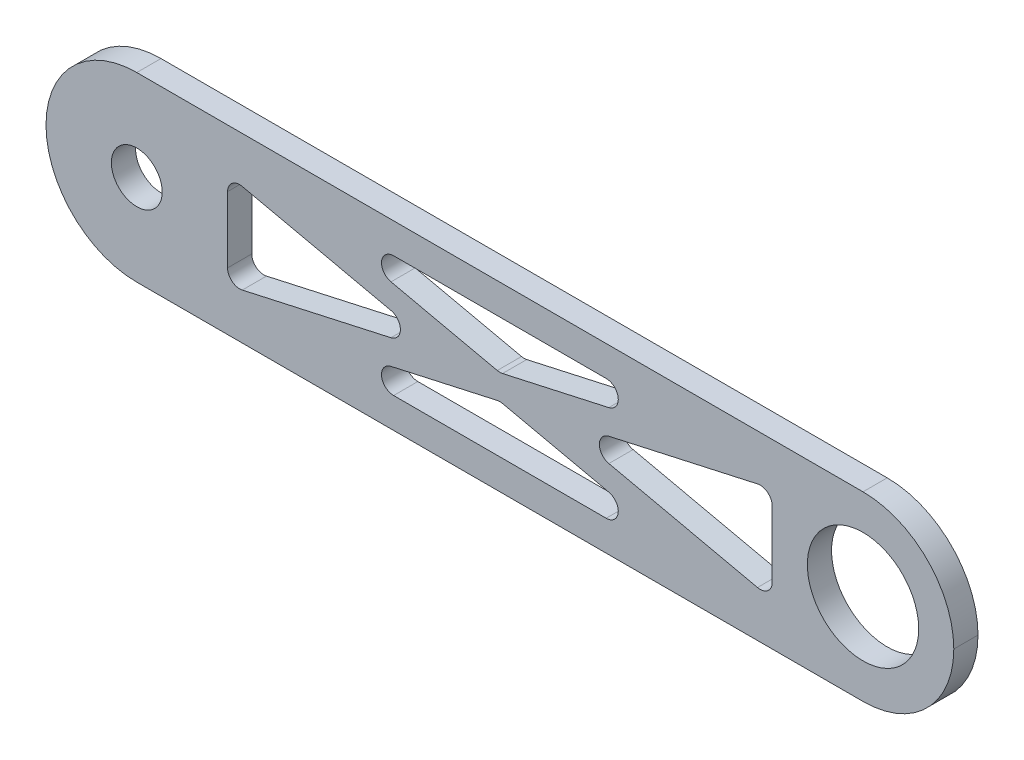
ISO-10303-21;
HEADER;
FILE_DESCRIPTION(('STEP AP214'),'2;1');
FILE_NAME('part.step','',(''),(''),'','','');
FILE_SCHEMA(('AUTOMOTIVE_DESIGN { 1 0 10303 214 1 1 1 1 }'));
ENDSEC;
DATA;
#1=APPLICATION_CONTEXT('core data for automotive mechanical design processes');
#2=APPLICATION_PROTOCOL_DEFINITION('international standard','automotive_design',2000,#1);
#3=PRODUCT_CONTEXT('',#1,'mechanical');
#4=PRODUCT('Part','Part','',(#3));
#5=PRODUCT_RELATED_PRODUCT_CATEGORY('part','',(#4));
#6=PRODUCT_DEFINITION_FORMATION('','',#4);
#7=PRODUCT_DEFINITION_CONTEXT('part definition',#1,'design');
#8=PRODUCT_DEFINITION('design','',#6,#7);
#9=PRODUCT_DEFINITION_SHAPE('','',#8);
#10=(LENGTH_UNIT() NAMED_UNIT(*) SI_UNIT(.MILLI.,.METRE.));
#11=(NAMED_UNIT(*) PLANE_ANGLE_UNIT() SI_UNIT($,.RADIAN.));
#12=(NAMED_UNIT(*) SI_UNIT($,.STERADIAN.) SOLID_ANGLE_UNIT());
#13=UNCERTAINTY_MEASURE_WITH_UNIT(LENGTH_MEASURE(1.E-05),#10,'distance_accuracy_value','');
#14=(GEOMETRIC_REPRESENTATION_CONTEXT(3) GLOBAL_UNCERTAINTY_ASSIGNED_CONTEXT((#13)) GLOBAL_UNIT_ASSIGNED_CONTEXT((#10,
#11,#12)) REPRESENTATION_CONTEXT('',''));
#15=CARTESIAN_POINT('',(0.,0.,0.));
#16=DIRECTION('',(0.,0.,1.));
#17=DIRECTION('',(1.,0.,0.));
#18=AXIS2_PLACEMENT_3D('',#15,#16,#17);
#19=CARTESIAN_POINT('',(-37.5,7.5,-2.));
#20=DIRECTION('',(0.,-1.,0.));
#21=DIRECTION('',(0.,0.,1.));
#22=AXIS2_PLACEMENT_3D('',#19,#20,#21);
#23=PLANE('',#22);
#24=DIRECTION('',(-1.,0.,0.));
#25=VECTOR('',#24,1.);
#26=CARTESIAN_POINT('',(-37.5,7.5,0.));
#27=LINE('',#26,#25);
#28=CARTESIAN_POINT('',(30.,7.5,0.));
#29=VERTEX_POINT('',#28);
#30=CARTESIAN_POINT('',(-30.,7.5,0.));
#31=VERTEX_POINT('',#30);
#32=EDGE_CURVE('E245',#29,#31,#27,.T.);
#33=ORIENTED_EDGE('',*,*,#32,.F.);
#34=DIRECTION('',(0.,0.,1.));
#35=VECTOR('',#34,1.);
#36=CARTESIAN_POINT('',(30.,7.5,-2.));
#37=LINE('',#36,#35);
#38=CARTESIAN_POINT('',(30.,7.5,-2.));
#39=VERTEX_POINT('',#38);
#40=EDGE_CURVE('E252',#39,#29,#37,.T.);
#41=ORIENTED_EDGE('',*,*,#40,.F.);
#42=DIRECTION('',(-1.,0.,0.));
#43=VECTOR('',#42,1.);
#44=CARTESIAN_POINT('',(-37.5,7.5,-2.));
#45=LINE('',#44,#43);
#46=CARTESIAN_POINT('',(-30.,7.5,-2.));
#47=VERTEX_POINT('',#46);
#48=EDGE_CURVE('E481',#39,#47,#45,.T.);
#49=ORIENTED_EDGE('',*,*,#48,.T.);
#50=DIRECTION('',(0.,0.,1.));
#51=VECTOR('',#50,1.);
#52=CARTESIAN_POINT('',(-30.,7.5,-2.));
#53=LINE('',#52,#51);
#54=EDGE_CURVE('E284',#31,#47,#53,.F.);
#55=ORIENTED_EDGE('',*,*,#54,.F.);
#56=EDGE_LOOP('',(#33,#41,#49,#55));
#57=FACE_BOUND('',#56,.T.);
#58=ADVANCED_FACE('F37',(#57),#23,.F.);
#59=CARTESIAN_POINT('',(-37.5,-7.5,-2.));
#60=DIRECTION('',(0.,1.,0.));
#61=DIRECTION('',(0.,0.,-1.));
#62=AXIS2_PLACEMENT_3D('',#59,#60,#61);
#63=PLANE('',#62);
#64=DIRECTION('',(1.,0.,0.));
#65=VECTOR('',#64,1.);
#66=CARTESIAN_POINT('',(-37.5,-7.5,0.));
#67=LINE('',#66,#65);
#68=CARTESIAN_POINT('',(-30.,-7.5,0.));
#69=VERTEX_POINT('',#68);
#70=CARTESIAN_POINT('',(30.,-7.5,0.));
#71=VERTEX_POINT('',#70);
#72=EDGE_CURVE('E261',#69,#71,#67,.T.);
#73=ORIENTED_EDGE('',*,*,#72,.F.);
#74=DIRECTION('',(0.,0.,1.));
#75=VECTOR('',#74,1.);
#76=CARTESIAN_POINT('',(-30.,-7.5,-2.));
#77=LINE('',#76,#75);
#78=CARTESIAN_POINT('',(-30.,-7.5,-2.));
#79=VERTEX_POINT('',#78);
#80=EDGE_CURVE('E270',#79,#69,#77,.T.);
#81=ORIENTED_EDGE('',*,*,#80,.F.);
#82=DIRECTION('',(1.,0.,0.));
#83=VECTOR('',#82,1.);
#84=CARTESIAN_POINT('',(-37.5,-7.5,-2.));
#85=LINE('',#84,#83);
#86=CARTESIAN_POINT('',(30.,-7.5,-2.));
#87=VERTEX_POINT('',#86);
#88=EDGE_CURVE('E256',#79,#87,#85,.T.);
#89=ORIENTED_EDGE('',*,*,#88,.T.);
#90=DIRECTION('',(0.,0.,1.));
#91=VECTOR('',#90,1.);
#92=CARTESIAN_POINT('',(30.,-7.5,-2.));
#93=LINE('',#92,#91);
#94=EDGE_CURVE('E273',#71,#87,#93,.F.);
#95=ORIENTED_EDGE('',*,*,#94,.F.);
#96=EDGE_LOOP('',(#73,#81,#89,#95));
#97=FACE_BOUND('',#96,.T.);
#98=ADVANCED_FACE('F498',(#97),#63,.F.);
#99=CARTESIAN_POINT('',(0.,0.,-2.));
#100=DIRECTION('',(0.,0.,1.));
#101=DIRECTION('',(-1.,0.,0.));
#102=AXIS2_PLACEMENT_3D('',#99,#100,#101);
#103=PLANE('',#102);
#104=DIRECTION('',(0.976187060183953,-0.216930457818656,0.));
#105=VECTOR('',#104,1.);
#106=CARTESIAN_POINT('',(4.60977222864645,0.,-2.));
#107=LINE('',#106,#105);
#108=CARTESIAN_POINT('',(9.00261399947423,-0.976187060183952,-2.));
#109=VERTEX_POINT('',#108);
#110=CARTESIAN_POINT('',(21.2830695421813,-3.70517718078553,-2.));
#111=VERTEX_POINT('',#110);
#112=EDGE_CURVE('E440',#109,#111,#107,.T.);
#113=ORIENTED_EDGE('',*,*,#112,.T.);
#114=CARTESIAN_POINT('',(21.5,-2.72899012060158,-2.));
#115=DIRECTION('',(0.,0.,-1.));
#116=DIRECTION('',(-1.,0.,0.));
#117=AXIS2_PLACEMENT_3D('',#114,#115,#116);
#118=CIRCLE('',#117,1.);
#119=CARTESIAN_POINT('',(22.5,-2.72899012060158,-2.));
#120=VERTEX_POINT('',#119);
#121=EDGE_CURVE('E45',#120,#111,#118,.T.);
#122=ORIENTED_EDGE('',*,*,#121,.F.);
#123=DIRECTION('',(0.,1.,0.));
#124=VECTOR('',#123,1.);
#125=CARTESIAN_POINT('',(22.5,-3.9756061714119,-2.));
#126=LINE('',#125,#124);
#127=CARTESIAN_POINT('',(22.5,2.72899012060158,-2.));
#128=VERTEX_POINT('',#127);
#129=EDGE_CURVE('E444',#120,#128,#126,.T.);
#130=ORIENTED_EDGE('',*,*,#129,.T.);
#131=CARTESIAN_POINT('',(21.5,2.72899012060158,-2.));
#132=DIRECTION('',(0.,0.,-1.));
#133=DIRECTION('',(-1.,0.,0.));
#134=AXIS2_PLACEMENT_3D('',#131,#132,#133);
#135=CIRCLE('',#134,1.);
#136=CARTESIAN_POINT('',(21.2830695421813,3.70517718078553,-2.));
#137=VERTEX_POINT('',#136);
#138=EDGE_CURVE('E425',#137,#128,#135,.T.);
#139=ORIENTED_EDGE('',*,*,#138,.F.);
#140=DIRECTION('',(-0.976187060183953,-0.216930457818656,0.));
#141=VECTOR('',#140,1.);
#142=CARTESIAN_POINT('',(4.60977222864645,0.,-2.));
#143=LINE('',#142,#141);
#144=CARTESIAN_POINT('',(9.00261399947423,0.976187060183954,-2.));
#145=VERTEX_POINT('',#144);
#146=EDGE_CURVE('E445',#137,#145,#143,.T.);
#147=ORIENTED_EDGE('',*,*,#146,.T.);
#148=CARTESIAN_POINT('',(9.21954445729289,0.,-2.));
#149=DIRECTION('',(0.,0.,-1.));
#150=DIRECTION('',(-1.,0.,0.));
#151=AXIS2_PLACEMENT_3D('',#148,#149,#150);
#152=CIRCLE('',#151,1.);
#153=EDGE_CURVE('E431',#109,#145,#152,.T.);
#154=ORIENTED_EDGE('',*,*,#153,.F.);
#155=EDGE_LOOP('',(#113,#122,#130,#139,#147,#154));
#156=FACE_BOUND('',#155,.T.);
#157=DIRECTION('',(-0.976187060183953,-0.216930457818656,0.));
#158=VECTOR('',#157,1.);
#159=CARTESIAN_POINT('',(-17.8902277713536,-5.,-2.));
#160=LINE('',#159,#158);
#161=CARTESIAN_POINT('',(-0.216930457818641,-1.07260059699224,-2.));
#162=VERTEX_POINT('',#161);
#163=CARTESIAN_POINT('',(-8.99738600052576,-3.02381293981605,-2.));
#164=VERTEX_POINT('',#163);
#165=EDGE_CURVE('E830',#162,#164,#160,.T.);
#166=ORIENTED_EDGE('',*,*,#165,.T.);
#167=CARTESIAN_POINT('',(-8.7804555427071,-4.,-2.));
#168=DIRECTION('',(0.,0.,-1.));
#169=DIRECTION('',(-1.,0.,0.));
#170=AXIS2_PLACEMENT_3D('',#167,#168,#169);
#171=CIRCLE('',#170,1.);
#172=CARTESIAN_POINT('',(-8.7804555427071,-5.,-2.));
#173=VERTEX_POINT('',#172);
#174=EDGE_CURVE('E413',#173,#164,#171,.T.);
#175=ORIENTED_EDGE('',*,*,#174,.F.);
#176=DIRECTION('',(1.,0.,0.));
#177=VECTOR('',#176,1.);
#178=CARTESIAN_POINT('',(-17.8902277713536,-5.,-2.));
#179=LINE('',#178,#177);
#180=CARTESIAN_POINT('',(8.78045554270711,-5.,-2.));
#181=VERTEX_POINT('',#180);
#182=EDGE_CURVE('E449',#173,#181,#179,.T.);
#183=ORIENTED_EDGE('',*,*,#182,.T.);
#184=CARTESIAN_POINT('',(8.78045554270711,-4.,-2.));
#185=DIRECTION('',(0.,0.,-1.));
#186=DIRECTION('',(-1.,0.,0.));
#187=AXIS2_PLACEMENT_3D('',#184,#185,#186);
#188=CIRCLE('',#187,1.);
#189=CARTESIAN_POINT('',(8.99738600052576,-3.02381293981605,-2.));
#190=VERTEX_POINT('',#189);
#191=EDGE_CURVE('E407',#190,#181,#188,.T.);
#192=ORIENTED_EDGE('',*,*,#191,.F.);
#193=DIRECTION('',(-0.976187060183953,0.216930457818656,0.));
#194=VECTOR('',#193,1.);
#195=CARTESIAN_POINT('',(0.,-1.0243938285881,-2.));
#196=LINE('',#195,#194);
#197=CARTESIAN_POINT('',(0.216930457818666,-1.07260059699225,-2.));
#198=VERTEX_POINT('',#197);
#199=EDGE_CURVE('E834',#190,#198,#196,.T.);
#200=ORIENTED_EDGE('',*,*,#199,.T.);
#201=CARTESIAN_POINT('',(0.,-2.0487876571762,-2.));
#202=DIRECTION('',(0.,0.,-1.));
#203=DIRECTION('',(-1.,0.,0.));
#204=AXIS2_PLACEMENT_3D('',#201,#202,#203);
#205=CIRCLE('',#204,1.);
#206=EDGE_CURVE('E419',#162,#198,#205,.T.);
#207=ORIENTED_EDGE('',*,*,#206,.F.);
#208=EDGE_LOOP('',(#166,#175,#183,#192,#200,#207));
#209=FACE_BOUND('',#208,.T.);
#210=DIRECTION('',(0.,-1.,0.));
#211=VECTOR('',#210,1.);
#212=CARTESIAN_POINT('',(-22.5,-3.9756061714119,-2.));
#213=LINE('',#212,#211);
#214=CARTESIAN_POINT('',(-22.5,2.72899012060158,-2.));
#215=VERTEX_POINT('',#214);
#216=CARTESIAN_POINT('',(-22.5,-2.72899012060158,-2.));
#217=VERTEX_POINT('',#216);
#218=EDGE_CURVE('E455',#215,#217,#213,.T.);
#219=ORIENTED_EDGE('',*,*,#218,.T.);
#220=CARTESIAN_POINT('',(-21.5,-2.72899012060158,-2.));
#221=DIRECTION('',(0.,0.,-1.));
#222=DIRECTION('',(-1.,0.,0.));
#223=AXIS2_PLACEMENT_3D('',#220,#221,#222);
#224=CIRCLE('',#223,1.);
#225=CARTESIAN_POINT('',(-21.2830695421813,-3.70517718078553,-2.));
#226=VERTEX_POINT('',#225);
#227=EDGE_CURVE('E395',#226,#217,#224,.T.);
#228=ORIENTED_EDGE('',*,*,#227,.F.);
#229=DIRECTION('',(0.976187060183953,0.216930457818656,0.));
#230=VECTOR('',#229,1.);
#231=CARTESIAN_POINT('',(-22.5,-3.9756061714119,-2.));
#232=LINE('',#231,#230);
#233=CARTESIAN_POINT('',(-9.00261399947423,-0.976187060183954,-2.));
#234=VERTEX_POINT('',#233);
#235=EDGE_CURVE('E458',#226,#234,#232,.T.);
#236=ORIENTED_EDGE('',*,*,#235,.T.);
#237=CARTESIAN_POINT('',(-9.21954445729288,0.,-2.));
#238=DIRECTION('',(0.,0.,-1.));
#239=DIRECTION('',(-1.,0.,0.));
#240=AXIS2_PLACEMENT_3D('',#237,#238,#239);
#241=CIRCLE('',#240,1.);
#242=CARTESIAN_POINT('',(-9.00261399947423,0.976187060183953,-2.));
#243=VERTEX_POINT('',#242);
#244=EDGE_CURVE('E389',#243,#234,#241,.T.);
#245=ORIENTED_EDGE('',*,*,#244,.F.);
#246=DIRECTION('',(-0.976187060183953,0.216930457818656,0.));
#247=VECTOR('',#246,1.);
#248=CARTESIAN_POINT('',(-22.5,3.9756061714119,-2.));
#249=LINE('',#248,#247);
#250=CARTESIAN_POINT('',(-21.2830695421813,3.70517718078553,-2.));
#251=VERTEX_POINT('',#250);
#252=EDGE_CURVE('E447',#243,#251,#249,.T.);
#253=ORIENTED_EDGE('',*,*,#252,.T.);
#254=CARTESIAN_POINT('',(-21.5,2.72899012060158,-2.));
#255=DIRECTION('',(0.,0.,-1.));
#256=DIRECTION('',(-1.,0.,0.));
#257=AXIS2_PLACEMENT_3D('',#254,#255,#256);
#258=CIRCLE('',#257,1.);
#259=EDGE_CURVE('E401',#215,#251,#258,.T.);
#260=ORIENTED_EDGE('',*,*,#259,.F.);
#261=EDGE_LOOP('',(#219,#228,#236,#245,#253,#260));
#262=FACE_BOUND('',#261,.T.);
#263=DIRECTION('',(0.976187060183953,0.216930457818656,0.));
#264=VECTOR('',#263,1.);
#265=CARTESIAN_POINT('',(0.,1.0243938285881,-2.));
#266=LINE('',#265,#264);
#267=CARTESIAN_POINT('',(0.21693045781866,1.07260059699225,-2.));
#268=VERTEX_POINT('',#267);
#269=CARTESIAN_POINT('',(8.99738600052576,3.02381293981605,-2.));
#270=VERTEX_POINT('',#269);
#271=EDGE_CURVE('E464',#268,#270,#266,.T.);
#272=ORIENTED_EDGE('',*,*,#271,.T.);
#273=CARTESIAN_POINT('',(8.7804555427071,4.,-2.));
#274=DIRECTION('',(0.,0.,-1.));
#275=DIRECTION('',(-1.,0.,0.));
#276=AXIS2_PLACEMENT_3D('',#273,#274,#275);
#277=CIRCLE('',#276,1.);
#278=CARTESIAN_POINT('',(8.7804555427071,5.,-2.));
#279=VERTEX_POINT('',#278);
#280=EDGE_CURVE('E377',#279,#270,#277,.T.);
#281=ORIENTED_EDGE('',*,*,#280,.F.);
#282=DIRECTION('',(-1.,0.,0.));
#283=VECTOR('',#282,1.);
#284=CARTESIAN_POINT('',(-17.8902277713536,5.,-2.));
#285=LINE('',#284,#283);
#286=CARTESIAN_POINT('',(-8.7804555427071,5.,-2.));
#287=VERTEX_POINT('',#286);
#288=EDGE_CURVE('E467',#279,#287,#285,.T.);
#289=ORIENTED_EDGE('',*,*,#288,.T.);
#290=CARTESIAN_POINT('',(-8.7804555427071,4.,-2.));
#291=DIRECTION('',(0.,0.,-1.));
#292=DIRECTION('',(-1.,0.,0.));
#293=AXIS2_PLACEMENT_3D('',#290,#291,#292);
#294=CIRCLE('',#293,1.);
#295=CARTESIAN_POINT('',(-8.99738600052576,3.02381293981605,-2.));
#296=VERTEX_POINT('',#295);
#297=EDGE_CURVE('E371',#296,#287,#294,.T.);
#298=ORIENTED_EDGE('',*,*,#297,.F.);
#299=DIRECTION('',(0.976187060183953,-0.216930457818656,0.));
#300=VECTOR('',#299,1.);
#301=CARTESIAN_POINT('',(-17.8902277713536,5.,-2.));
#302=LINE('',#301,#300);
#303=CARTESIAN_POINT('',(-0.216930457818648,1.07260059699224,-2.));
#304=VERTEX_POINT('',#303);
#305=EDGE_CURVE('E461',#296,#304,#302,.T.);
#306=ORIENTED_EDGE('',*,*,#305,.T.);
#307=CARTESIAN_POINT('',(0.,2.0487876571762,-2.));
#308=DIRECTION('',(0.,0.,-1.));
#309=DIRECTION('',(-1.,0.,0.));
#310=AXIS2_PLACEMENT_3D('',#307,#308,#309);
#311=CIRCLE('',#310,1.);
#312=EDGE_CURVE('E383',#268,#304,#311,.T.);
#313=ORIENTED_EDGE('',*,*,#312,.F.);
#314=EDGE_LOOP('',(#272,#281,#289,#298,#306,#313));
#315=FACE_BOUND('',#314,.T.);
#316=CARTESIAN_POINT('',(-30.,0.,-2.));
#317=DIRECTION('',(0.,0.,1.));
#318=DIRECTION('',(1.,0.,0.));
#319=AXIS2_PLACEMENT_3D('',#316,#317,#318);
#320=CIRCLE('',#319,2.1);
#321=CARTESIAN_POINT('',(-27.9,0.,-2.));
#322=VERTEX_POINT('',#321);
#323=EDGE_CURVE('E470',#322,#322,#320,.T.);
#324=ORIENTED_EDGE('',*,*,#323,.T.);
#325=EDGE_LOOP('',(#324));
#326=FACE_BOUND('',#325,.T.);
#327=CARTESIAN_POINT('',(30.,0.,-2.));
#328=DIRECTION('',(0.,0.,1.));
#329=DIRECTION('',(1.,0.,0.));
#330=AXIS2_PLACEMENT_3D('',#327,#328,#329);
#331=CIRCLE('',#330,4.6);
#332=CARTESIAN_POINT('',(34.6,0.,-2.));
#333=VERTEX_POINT('',#332);
#334=EDGE_CURVE('E474',#333,#333,#331,.T.);
#335=ORIENTED_EDGE('',*,*,#334,.T.);
#336=EDGE_LOOP('',(#335));
#337=FACE_BOUND('',#336,.T.);
#338=CARTESIAN_POINT('',(-30.,0.,-2.));
#339=DIRECTION('',(0.,0.,-1.));
#340=DIRECTION('',(-1.,0.,0.));
#341=AXIS2_PLACEMENT_3D('',#338,#339,#340);
#342=CIRCLE('',#341,7.5);
#343=CARTESIAN_POINT('',(-37.5,0.,-2.));
#344=VERTEX_POINT('',#343);
#345=EDGE_CURVE('E278',#47,#344,#342,.F.);
#346=ORIENTED_EDGE('',*,*,#345,.F.);
#347=ORIENTED_EDGE('',*,*,#48,.F.);
#348=CARTESIAN_POINT('',(30.,0.,-2.));
#349=DIRECTION('',(0.,0.,-1.));
#350=DIRECTION('',(-1.,0.,0.));
#351=AXIS2_PLACEMENT_3D('',#348,#349,#350);
#352=CIRCLE('',#351,7.5);
#353=CARTESIAN_POINT('',(37.5,0.,-2.));
#354=VERTEX_POINT('',#353);
#355=EDGE_CURVE('E275',#354,#39,#352,.F.);
#356=ORIENTED_EDGE('',*,*,#355,.F.);
#357=CARTESIAN_POINT('',(30.,0.,-2.));
#358=DIRECTION('',(0.,0.,-1.));
#359=DIRECTION('',(-1.,0.,0.));
#360=AXIS2_PLACEMENT_3D('',#357,#358,#359);
#361=CIRCLE('',#360,7.5);
#362=EDGE_CURVE('E242',#87,#354,#361,.F.);
#363=ORIENTED_EDGE('',*,*,#362,.F.);
#364=ORIENTED_EDGE('',*,*,#88,.F.);
#365=CARTESIAN_POINT('',(-30.,0.,-2.));
#366=DIRECTION('',(0.,0.,-1.));
#367=DIRECTION('',(-1.,0.,0.));
#368=AXIS2_PLACEMENT_3D('',#365,#366,#367);
#369=CIRCLE('',#368,7.5);
#370=EDGE_CURVE('E281',#344,#79,#369,.F.);
#371=ORIENTED_EDGE('',*,*,#370,.F.);
#372=EDGE_LOOP('',(#346,#347,#356,#363,#364,#371));
#373=FACE_BOUND('',#372,.T.);
#374=ADVANCED_FACE('F441',(#156,#209,#262,#315,#326,#337,#373),#103,.F.);
#375=CARTESIAN_POINT('',(0.,0.,0.));
#376=DIRECTION('',(0.,0.,1.));
#377=DIRECTION('',(-1.,0.,0.));
#378=AXIS2_PLACEMENT_3D('',#375,#376,#377);
#379=PLANE('',#378);
#380=DIRECTION('',(0.976187060183953,0.216930457818656,0.));
#381=VECTOR('',#380,1.);
#382=CARTESIAN_POINT('',(0.216930457818657,-0.976187060183954,0.));
#383=LINE('',#382,#381);
#384=CARTESIAN_POINT('',(9.00261399947424,0.976187060183954,0.));
#385=VERTEX_POINT('',#384);
#386=CARTESIAN_POINT('',(21.2830695421813,3.70517718078554,0.));
#387=VERTEX_POINT('',#386);
#388=EDGE_CURVE('E322',#385,#387,#383,.T.);
#389=ORIENTED_EDGE('',*,*,#388,.T.);
#390=CARTESIAN_POINT('',(21.5,2.72899012060158,0.));
#391=DIRECTION('',(0.,0.,-1.));
#392=DIRECTION('',(-1.,0.,0.));
#393=AXIS2_PLACEMENT_3D('',#390,#391,#392);
#394=CIRCLE('',#393,1.);
#395=CARTESIAN_POINT('',(22.5,2.72899012060158,0.));
#396=VERTEX_POINT('',#395);
#397=EDGE_CURVE('E428',#396,#387,#394,.F.);
#398=ORIENTED_EDGE('',*,*,#397,.F.);
#399=DIRECTION('',(0.,-1.,0.));
#400=VECTOR('',#399,1.);
#401=CARTESIAN_POINT('',(22.5,0.,0.));
#402=LINE('',#401,#400);
#403=CARTESIAN_POINT('',(22.5,-2.72899012060158,0.));
#404=VERTEX_POINT('',#403);
#405=EDGE_CURVE('E319',#396,#404,#402,.T.);
#406=ORIENTED_EDGE('',*,*,#405,.T.);
#407=CARTESIAN_POINT('',(21.5,-2.72899012060158,0.));
#408=DIRECTION('',(0.,0.,-1.));
#409=DIRECTION('',(-1.,0.,0.));
#410=AXIS2_PLACEMENT_3D('',#407,#408,#409);
#411=CIRCLE('',#410,1.);
#412=CARTESIAN_POINT('',(21.2830695421813,-3.70517718078553,0.));
#413=VERTEX_POINT('',#412);
#414=EDGE_CURVE('E11',#413,#404,#411,.F.);
#415=ORIENTED_EDGE('',*,*,#414,.F.);
#416=DIRECTION('',(-0.976187060183953,0.216930457818656,0.));
#417=VECTOR('',#416,1.);
#418=CARTESIAN_POINT('',(0.216930457818657,0.976187060183956,0.));
#419=LINE('',#418,#417);
#420=CARTESIAN_POINT('',(9.00261399947424,-0.976187060183952,0.));
#421=VERTEX_POINT('',#420);
#422=EDGE_CURVE('E316',#413,#421,#419,.T.);
#423=ORIENTED_EDGE('',*,*,#422,.T.);
#424=CARTESIAN_POINT('',(9.21954445729289,0.,0.));
#425=DIRECTION('',(0.,0.,-1.));
#426=DIRECTION('',(-1.,0.,0.));
#427=AXIS2_PLACEMENT_3D('',#424,#425,#426);
#428=CIRCLE('',#427,1.);
#429=EDGE_CURVE('E433',#385,#421,#428,.F.);
#430=ORIENTED_EDGE('',*,*,#429,.F.);
#431=EDGE_LOOP('',(#389,#398,#406,#415,#423,#430));
#432=FACE_BOUND('',#431,.T.);
#433=DIRECTION('',(0.976187060183953,-0.216930457818656,0.));
#434=VECTOR('',#433,1.);
#435=CARTESIAN_POINT('',(-0.216930457818656,-0.976187060183952,0.));
#436=LINE('',#435,#434);
#437=CARTESIAN_POINT('',(0.216930457818667,-1.07260059699225,0.));
#438=VERTEX_POINT('',#437);
#439=CARTESIAN_POINT('',(8.99738600052577,-3.02381293981605,0.));
#440=VERTEX_POINT('',#439);
#441=EDGE_CURVE('E313',#438,#440,#436,.T.);
#442=ORIENTED_EDGE('',*,*,#441,.T.);
#443=CARTESIAN_POINT('',(8.78045554270711,-4.,0.));
#444=DIRECTION('',(0.,0.,-1.));
#445=DIRECTION('',(-1.,0.,0.));
#446=AXIS2_PLACEMENT_3D('',#443,#444,#445);
#447=CIRCLE('',#446,1.);
#448=CARTESIAN_POINT('',(8.78045554270711,-5.,0.));
#449=VERTEX_POINT('',#448);
#450=EDGE_CURVE('E410',#449,#440,#447,.F.);
#451=ORIENTED_EDGE('',*,*,#450,.F.);
#452=DIRECTION('',(-1.,0.,0.));
#453=VECTOR('',#452,1.);
#454=CARTESIAN_POINT('',(0.,-5.,0.));
#455=LINE('',#454,#453);
#456=CARTESIAN_POINT('',(-8.7804555427071,-5.,0.));
#457=VERTEX_POINT('',#456);
#458=EDGE_CURVE('E310',#449,#457,#455,.T.);
#459=ORIENTED_EDGE('',*,*,#458,.T.);
#460=CARTESIAN_POINT('',(-8.7804555427071,-4.,0.));
#461=DIRECTION('',(0.,0.,-1.));
#462=DIRECTION('',(-1.,0.,0.));
#463=AXIS2_PLACEMENT_3D('',#460,#461,#462);
#464=CIRCLE('',#463,1.);
#465=CARTESIAN_POINT('',(-8.99738600052576,-3.02381293981605,0.));
#466=VERTEX_POINT('',#465);
#467=EDGE_CURVE('E416',#466,#457,#464,.F.);
#468=ORIENTED_EDGE('',*,*,#467,.F.);
#469=DIRECTION('',(0.976187060183953,0.216930457818656,0.));
#470=VECTOR('',#469,1.);
#471=CARTESIAN_POINT('',(0.216930457818657,-0.976187060183955,0.));
#472=LINE('',#471,#470);
#473=CARTESIAN_POINT('',(-0.216930457818646,-1.07260059699224,0.));
#474=VERTEX_POINT('',#473);
#475=EDGE_CURVE('E307',#466,#474,#472,.T.);
#476=ORIENTED_EDGE('',*,*,#475,.T.);
#477=CARTESIAN_POINT('',(0.,-2.0487876571762,0.));
#478=DIRECTION('',(0.,0.,-1.));
#479=DIRECTION('',(-1.,0.,0.));
#480=AXIS2_PLACEMENT_3D('',#477,#478,#479);
#481=CIRCLE('',#480,1.);
#482=EDGE_CURVE('E422',#438,#474,#481,.F.);
#483=ORIENTED_EDGE('',*,*,#482,.F.);
#484=EDGE_LOOP('',(#442,#451,#459,#468,#476,#483));
#485=FACE_BOUND('',#484,.T.);
#486=DIRECTION('',(0.976187060183953,-0.216930457818656,0.));
#487=VECTOR('',#486,1.);
#488=CARTESIAN_POINT('',(-0.216930457818656,-0.976187060183954,0.));
#489=LINE('',#488,#487);
#490=CARTESIAN_POINT('',(-21.2830695421813,3.70517718078553,0.));
#491=VERTEX_POINT('',#490);
#492=CARTESIAN_POINT('',(-9.00261399947423,0.976187060183952,0.));
#493=VERTEX_POINT('',#492);
#494=EDGE_CURVE('E304',#491,#493,#489,.T.);
#495=ORIENTED_EDGE('',*,*,#494,.T.);
#496=CARTESIAN_POINT('',(-9.21954445729288,0.,0.));
#497=DIRECTION('',(0.,0.,-1.));
#498=DIRECTION('',(-1.,0.,0.));
#499=AXIS2_PLACEMENT_3D('',#496,#497,#498);
#500=CIRCLE('',#499,1.);
#501=CARTESIAN_POINT('',(-9.00261399947423,-0.976187060183954,0.));
#502=VERTEX_POINT('',#501);
#503=EDGE_CURVE('E392',#502,#493,#500,.F.);
#504=ORIENTED_EDGE('',*,*,#503,.F.);
#505=DIRECTION('',(-0.976187060183953,-0.216930457818656,0.));
#506=VECTOR('',#505,1.);
#507=CARTESIAN_POINT('',(-0.216930457818656,0.976187060183952,0.));
#508=LINE('',#507,#506);
#509=CARTESIAN_POINT('',(-21.2830695421813,-3.70517718078553,0.));
#510=VERTEX_POINT('',#509);
#511=EDGE_CURVE('E301',#502,#510,#508,.T.);
#512=ORIENTED_EDGE('',*,*,#511,.T.);
#513=CARTESIAN_POINT('',(-21.5,-2.72899012060158,0.));
#514=DIRECTION('',(0.,0.,-1.));
#515=DIRECTION('',(-1.,0.,0.));
#516=AXIS2_PLACEMENT_3D('',#513,#514,#515);
#517=CIRCLE('',#516,1.);
#518=CARTESIAN_POINT('',(-22.5,-2.72899012060158,0.));
#519=VERTEX_POINT('',#518);
#520=EDGE_CURVE('E398',#519,#510,#517,.F.);
#521=ORIENTED_EDGE('',*,*,#520,.F.);
#522=DIRECTION('',(0.,1.,0.));
#523=VECTOR('',#522,1.);
#524=CARTESIAN_POINT('',(-22.5,0.,0.));
#525=LINE('',#524,#523);
#526=CARTESIAN_POINT('',(-22.5,2.72899012060158,0.));
#527=VERTEX_POINT('',#526);
#528=EDGE_CURVE('E298',#519,#527,#525,.T.);
#529=ORIENTED_EDGE('',*,*,#528,.T.);
#530=CARTESIAN_POINT('',(-21.5,2.72899012060158,0.));
#531=DIRECTION('',(0.,0.,-1.));
#532=DIRECTION('',(-1.,0.,0.));
#533=AXIS2_PLACEMENT_3D('',#530,#531,#532);
#534=CIRCLE('',#533,1.);
#535=EDGE_CURVE('E404',#491,#527,#534,.F.);
#536=ORIENTED_EDGE('',*,*,#535,.F.);
#537=EDGE_LOOP('',(#495,#504,#512,#521,#529,#536));
#538=FACE_BOUND('',#537,.T.);
#539=DIRECTION('',(-0.976187060183953,0.216930457818656,0.));
#540=VECTOR('',#539,1.);
#541=CARTESIAN_POINT('',(0.216930457818657,0.976187060183955,0.));
#542=LINE('',#541,#540);
#543=CARTESIAN_POINT('',(-0.216930457818652,1.07260059699225,0.));
#544=VERTEX_POINT('',#543);
#545=CARTESIAN_POINT('',(-8.99738600052576,3.02381293981605,0.));
#546=VERTEX_POINT('',#545);
#547=EDGE_CURVE('E295',#544,#546,#542,.T.);
#548=ORIENTED_EDGE('',*,*,#547,.T.);
#549=CARTESIAN_POINT('',(-8.7804555427071,4.,0.));
#550=DIRECTION('',(0.,0.,-1.));
#551=DIRECTION('',(-1.,0.,0.));
#552=AXIS2_PLACEMENT_3D('',#549,#550,#551);
#553=CIRCLE('',#552,1.);
#554=CARTESIAN_POINT('',(-8.7804555427071,5.,0.));
#555=VERTEX_POINT('',#554);
#556=EDGE_CURVE('E374',#555,#546,#553,.F.);
#557=ORIENTED_EDGE('',*,*,#556,.F.);
#558=DIRECTION('',(1.,0.,0.));
#559=VECTOR('',#558,1.);
#560=CARTESIAN_POINT('',(0.,5.,0.));
#561=LINE('',#560,#559);
#562=CARTESIAN_POINT('',(8.7804555427071,5.,0.));
#563=VERTEX_POINT('',#562);
#564=EDGE_CURVE('E292',#555,#563,#561,.T.);
#565=ORIENTED_EDGE('',*,*,#564,.T.);
#566=CARTESIAN_POINT('',(8.7804555427071,4.,0.));
#567=DIRECTION('',(0.,0.,-1.));
#568=DIRECTION('',(-1.,0.,0.));
#569=AXIS2_PLACEMENT_3D('',#566,#567,#568);
#570=CIRCLE('',#569,1.);
#571=CARTESIAN_POINT('',(8.99738600052576,3.02381293981605,0.));
#572=VERTEX_POINT('',#571);
#573=EDGE_CURVE('E380',#572,#563,#570,.F.);
#574=ORIENTED_EDGE('',*,*,#573,.F.);
#575=DIRECTION('',(-0.976187060183953,-0.216930457818656,0.));
#576=VECTOR('',#575,1.);
#577=CARTESIAN_POINT('',(-0.216930457818656,0.976187060183954,0.));
#578=LINE('',#577,#576);
#579=CARTESIAN_POINT('',(0.21693045781866,1.07260059699225,0.));
#580=VERTEX_POINT('',#579);
#581=EDGE_CURVE('E286',#572,#580,#578,.T.);
#582=ORIENTED_EDGE('',*,*,#581,.T.);
#583=CARTESIAN_POINT('',(0.,2.0487876571762,0.));
#584=DIRECTION('',(0.,0.,-1.));
#585=DIRECTION('',(-1.,0.,0.));
#586=AXIS2_PLACEMENT_3D('',#583,#584,#585);
#587=CIRCLE('',#586,1.);
#588=EDGE_CURVE('E386',#544,#580,#587,.F.);
#589=ORIENTED_EDGE('',*,*,#588,.F.);
#590=EDGE_LOOP('',(#548,#557,#565,#574,#582,#589));
#591=FACE_BOUND('',#590,.T.);
#592=CARTESIAN_POINT('',(-30.,0.,0.));
#593=DIRECTION('',(0.,0.,1.));
#594=DIRECTION('',(1.,0.,0.));
#595=AXIS2_PLACEMENT_3D('',#592,#593,#594);
#596=CIRCLE('',#595,2.1);
#597=CARTESIAN_POINT('',(-27.9,0.,0.));
#598=VERTEX_POINT('',#597);
#599=EDGE_CURVE('E471',#598,#598,#596,.T.);
#600=ORIENTED_EDGE('',*,*,#599,.F.);
#601=EDGE_LOOP('',(#600));
#602=FACE_BOUND('',#601,.T.);
#603=CARTESIAN_POINT('',(30.,0.,0.));
#604=DIRECTION('',(0.,0.,1.));
#605=DIRECTION('',(1.,0.,0.));
#606=AXIS2_PLACEMENT_3D('',#603,#604,#605);
#607=CIRCLE('',#606,4.6);
#608=CARTESIAN_POINT('',(34.6,0.,0.));
#609=VERTEX_POINT('',#608);
#610=EDGE_CURVE('E289',#609,#609,#607,.T.);
#611=ORIENTED_EDGE('',*,*,#610,.F.);
#612=EDGE_LOOP('',(#611));
#613=FACE_BOUND('',#612,.T.);
#614=ORIENTED_EDGE('',*,*,#72,.T.);
#615=CARTESIAN_POINT('',(30.,0.,0.));
#616=DIRECTION('',(0.,0.,-1.));
#617=DIRECTION('',(-1.,0.,0.));
#618=AXIS2_PLACEMENT_3D('',#615,#616,#617);
#619=CIRCLE('',#618,7.5);
#620=CARTESIAN_POINT('',(37.5,0.,0.));
#621=VERTEX_POINT('',#620);
#622=EDGE_CURVE('E240',#621,#71,#619,.T.);
#623=ORIENTED_EDGE('',*,*,#622,.F.);
#624=CARTESIAN_POINT('',(30.,0.,0.));
#625=DIRECTION('',(0.,0.,-1.));
#626=DIRECTION('',(-1.,0.,0.));
#627=AXIS2_PLACEMENT_3D('',#624,#625,#626);
#628=CIRCLE('',#627,7.5);
#629=EDGE_CURVE('E249',#29,#621,#628,.T.);
#630=ORIENTED_EDGE('',*,*,#629,.F.);
#631=ORIENTED_EDGE('',*,*,#32,.T.);
#632=CARTESIAN_POINT('',(-30.,0.,0.));
#633=DIRECTION('',(0.,0.,-1.));
#634=DIRECTION('',(-1.,0.,0.));
#635=AXIS2_PLACEMENT_3D('',#632,#633,#634);
#636=CIRCLE('',#635,7.5);
#637=CARTESIAN_POINT('',(-37.5,0.,0.));
#638=VERTEX_POINT('',#637);
#639=EDGE_CURVE('E262',#638,#31,#636,.T.);
#640=ORIENTED_EDGE('',*,*,#639,.F.);
#641=CARTESIAN_POINT('',(-30.,0.,0.));
#642=DIRECTION('',(0.,0.,-1.));
#643=DIRECTION('',(-1.,0.,0.));
#644=AXIS2_PLACEMENT_3D('',#641,#642,#643);
#645=CIRCLE('',#644,7.5);
#646=EDGE_CURVE('E264',#69,#638,#645,.T.);
#647=ORIENTED_EDGE('',*,*,#646,.F.);
#648=EDGE_LOOP('',(#614,#623,#630,#631,#640,#647));
#649=FACE_BOUND('',#648,.T.);
#650=ADVANCED_FACE('F259',(#432,#485,#538,#591,#602,#613,#649),#379,.T.);
#651=CARTESIAN_POINT('',(30.,0.,-2.));
#652=DIRECTION('',(0.,0.,1.));
#653=DIRECTION('',(-1.,0.,0.));
#654=AXIS2_PLACEMENT_3D('',#651,#652,#653);
#655=CYLINDRICAL_SURFACE('',#654,7.5);
#656=ORIENTED_EDGE('',*,*,#40,.T.);
#657=ORIENTED_EDGE('',*,*,#629,.T.);
#658=DIRECTION('',(0.,0.,1.));
#659=VECTOR('',#658,1.);
#660=CARTESIAN_POINT('',(37.5,0.,-2.));
#661=LINE('',#660,#659);
#662=EDGE_CURVE('E235',#621,#354,#661,.F.);
#663=ORIENTED_EDGE('',*,*,#662,.T.);
#664=ORIENTED_EDGE('',*,*,#355,.T.);
#665=EDGE_LOOP('',(#656,#657,#663,#664));
#666=FACE_BOUND('',#665,.T.);
#667=ADVANCED_FACE('F250',(#666),#655,.T.);
#668=CARTESIAN_POINT('',(30.,0.,-2.));
#669=DIRECTION('',(0.,0.,1.));
#670=DIRECTION('',(-1.,0.,0.));
#671=AXIS2_PLACEMENT_3D('',#668,#669,#670);
#672=CYLINDRICAL_SURFACE('',#671,7.5);
#673=ORIENTED_EDGE('',*,*,#362,.T.);
#674=ORIENTED_EDGE('',*,*,#662,.F.);
#675=ORIENTED_EDGE('',*,*,#622,.T.);
#676=ORIENTED_EDGE('',*,*,#94,.T.);
#677=EDGE_LOOP('',(#673,#674,#675,#676));
#678=FACE_BOUND('',#677,.T.);
#679=ADVANCED_FACE('F237',(#678),#672,.T.);
#680=CARTESIAN_POINT('',(-30.,0.,-2.));
#681=DIRECTION('',(0.,0.,1.));
#682=DIRECTION('',(-1.,0.,0.));
#683=AXIS2_PLACEMENT_3D('',#680,#681,#682);
#684=CYLINDRICAL_SURFACE('',#683,7.5);
#685=DIRECTION('',(0.,0.,1.));
#686=VECTOR('',#685,1.);
#687=CARTESIAN_POINT('',(-37.5,0.,-2.));
#688=LINE('',#687,#686);
#689=EDGE_CURVE('E246',#344,#638,#688,.T.);
#690=ORIENTED_EDGE('',*,*,#689,.T.);
#691=ORIENTED_EDGE('',*,*,#639,.T.);
#692=ORIENTED_EDGE('',*,*,#54,.T.);
#693=ORIENTED_EDGE('',*,*,#345,.T.);
#694=EDGE_LOOP('',(#690,#691,#692,#693));
#695=FACE_BOUND('',#694,.T.);
#696=ADVANCED_FACE('F491',(#695),#684,.T.);
#697=CARTESIAN_POINT('',(-30.,0.,-2.));
#698=DIRECTION('',(0.,0.,1.));
#699=DIRECTION('',(-1.,0.,0.));
#700=AXIS2_PLACEMENT_3D('',#697,#698,#699);
#701=CYLINDRICAL_SURFACE('',#700,7.5);
#702=ORIENTED_EDGE('',*,*,#370,.T.);
#703=ORIENTED_EDGE('',*,*,#80,.T.);
#704=ORIENTED_EDGE('',*,*,#646,.T.);
#705=ORIENTED_EDGE('',*,*,#689,.F.);
#706=EDGE_LOOP('',(#702,#703,#704,#705));
#707=FACE_BOUND('',#706,.T.);
#708=ADVANCED_FACE('F494',(#707),#701,.T.);
#709=CARTESIAN_POINT('',(30.,0.,0.));
#710=DIRECTION('',(0.,0.,-1.));
#711=DIRECTION('',(1.,0.,0.));
#712=AXIS2_PLACEMENT_3D('',#709,#710,#711);
#713=CYLINDRICAL_SURFACE('',#712,4.6);
#714=ORIENTED_EDGE('',*,*,#610,.T.);
#715=EDGE_LOOP('',(#714));
#716=FACE_BOUND('',#715,.T.);
#717=ORIENTED_EDGE('',*,*,#334,.F.);
#718=EDGE_LOOP('',(#717));
#719=FACE_BOUND('',#718,.T.);
#720=ADVANCED_FACE('F521',(#716,#719),#713,.F.);
#721=CARTESIAN_POINT('',(-30.,0.,0.));
#722=DIRECTION('',(0.,0.,-1.));
#723=DIRECTION('',(1.,0.,0.));
#724=AXIS2_PLACEMENT_3D('',#721,#722,#723);
#725=CYLINDRICAL_SURFACE('',#724,2.1);
#726=ORIENTED_EDGE('',*,*,#599,.T.);
#727=EDGE_LOOP('',(#726));
#728=FACE_BOUND('',#727,.T.);
#729=ORIENTED_EDGE('',*,*,#323,.F.);
#730=EDGE_LOOP('',(#729));
#731=FACE_BOUND('',#730,.T.);
#732=ADVANCED_FACE('F612',(#728,#731),#725,.F.);
#733=CARTESIAN_POINT('',(-17.8902277713536,5.,8.));
#734=DIRECTION('',(-0.216930457818656,-0.976187060183953,0.));
#735=DIRECTION('',(0.976187060183953,-0.216930457818656,0.));
#736=AXIS2_PLACEMENT_3D('',#733,#734,#735);
#737=PLANE('',#736);
#738=ORIENTED_EDGE('',*,*,#547,.F.);
#739=DIRECTION('',(0.,0.,-1.));
#740=VECTOR('',#739,1.);
#741=CARTESIAN_POINT('',(-0.216930457818652,1.07260059699225,0.));
#742=LINE('',#741,#740);
#743=EDGE_CURVE('E325',#304,#544,#742,.F.);
#744=ORIENTED_EDGE('',*,*,#743,.F.);
#745=ORIENTED_EDGE('',*,*,#305,.F.);
#746=DIRECTION('',(0.,0.,-1.));
#747=VECTOR('',#746,1.);
#748=CARTESIAN_POINT('',(-8.99738600052576,3.02381293981605,-2.));
#749=LINE('',#748,#747);
#750=EDGE_CURVE('E327',#546,#296,#749,.T.);
#751=ORIENTED_EDGE('',*,*,#750,.F.);
#752=EDGE_LOOP('',(#738,#744,#745,#751));
#753=FACE_BOUND('',#752,.T.);
#754=ADVANCED_FACE('F605',(#753),#737,.F.);
#755=CARTESIAN_POINT('',(-17.8902277713536,5.,8.));
#756=DIRECTION('',(0.,1.,0.));
#757=DIRECTION('',(-1.,0.,0.));
#758=AXIS2_PLACEMENT_3D('',#755,#756,#757);
#759=PLANE('',#758);
#760=ORIENTED_EDGE('',*,*,#288,.F.);
#761=DIRECTION('',(0.,0.,-1.));
#762=VECTOR('',#761,1.);
#763=CARTESIAN_POINT('',(8.7804555427071,5.,-2.));
#764=LINE('',#763,#762);
#765=EDGE_CURVE('E329',#563,#279,#764,.T.);
#766=ORIENTED_EDGE('',*,*,#765,.F.);
#767=ORIENTED_EDGE('',*,*,#564,.F.);
#768=DIRECTION('',(0.,0.,-1.));
#769=VECTOR('',#768,1.);
#770=CARTESIAN_POINT('',(-8.7804555427071,5.,0.));
#771=LINE('',#770,#769);
#772=EDGE_CURVE('E331',#287,#555,#771,.F.);
#773=ORIENTED_EDGE('',*,*,#772,.F.);
#774=EDGE_LOOP('',(#760,#766,#767,#773));
#775=FACE_BOUND('',#774,.T.);
#776=ADVANCED_FACE('F602',(#775),#759,.F.);
#777=CARTESIAN_POINT('',(0.,1.0243938285881,8.));
#778=DIRECTION('',(0.216930457818656,-0.976187060183953,0.));
#779=DIRECTION('',(0.976187060183953,0.216930457818656,0.));
#780=AXIS2_PLACEMENT_3D('',#777,#778,#779);
#781=PLANE('',#780);
#782=ORIENTED_EDGE('',*,*,#271,.F.);
#783=DIRECTION('',(0.,0.,-1.));
#784=VECTOR('',#783,1.);
#785=CARTESIAN_POINT('',(0.21693045781866,1.07260059699225,-2.));
#786=LINE('',#785,#784);
#787=EDGE_CURVE('E333',#580,#268,#786,.T.);
#788=ORIENTED_EDGE('',*,*,#787,.F.);
#789=ORIENTED_EDGE('',*,*,#581,.F.);
#790=DIRECTION('',(0.,0.,-1.));
#791=VECTOR('',#790,1.);
#792=CARTESIAN_POINT('',(8.99738600052576,3.02381293981605,0.));
#793=LINE('',#792,#791);
#794=EDGE_CURVE('E335',#270,#572,#793,.F.);
#795=ORIENTED_EDGE('',*,*,#794,.F.);
#796=EDGE_LOOP('',(#782,#788,#789,#795));
#797=FACE_BOUND('',#796,.T.);
#798=ADVANCED_FACE('F600',(#797),#781,.F.);
#799=CARTESIAN_POINT('',(-22.5,3.9756061714119,8.));
#800=DIRECTION('',(0.216930457818656,0.976187060183953,0.));
#801=DIRECTION('',(-0.976187060183953,0.216930457818656,0.));
#802=AXIS2_PLACEMENT_3D('',#799,#800,#801);
#803=PLANE('',#802);
#804=ORIENTED_EDGE('',*,*,#494,.F.);
#805=DIRECTION('',(0.,0.,-1.));
#806=VECTOR('',#805,1.);
#807=CARTESIAN_POINT('',(-21.2830695421813,3.70517718078553,0.));
#808=LINE('',#807,#806);
#809=EDGE_CURVE('E337',#251,#491,#808,.F.);
#810=ORIENTED_EDGE('',*,*,#809,.F.);
#811=ORIENTED_EDGE('',*,*,#252,.F.);
#812=DIRECTION('',(0.,0.,-1.));
#813=VECTOR('',#812,1.);
#814=CARTESIAN_POINT('',(-9.00261399947423,0.976187060183952,-2.));
#815=LINE('',#814,#813);
#816=EDGE_CURVE('E339',#493,#243,#815,.T.);
#817=ORIENTED_EDGE('',*,*,#816,.F.);
#818=EDGE_LOOP('',(#804,#810,#811,#817));
#819=FACE_BOUND('',#818,.T.);
#820=ADVANCED_FACE('F592',(#819),#803,.F.);
#821=CARTESIAN_POINT('',(-22.5,-3.9756061714119,8.));
#822=DIRECTION('',(0.216930457818656,-0.976187060183953,0.));
#823=DIRECTION('',(0.976187060183953,0.216930457818656,0.));
#824=AXIS2_PLACEMENT_3D('',#821,#822,#823);
#825=PLANE('',#824);
#826=ORIENTED_EDGE('',*,*,#235,.F.);
#827=DIRECTION('',(0.,0.,-1.));
#828=VECTOR('',#827,1.);
#829=CARTESIAN_POINT('',(-21.2830695421813,-3.70517718078553,-2.));
#830=LINE('',#829,#828);
#831=EDGE_CURVE('E341',#510,#226,#830,.T.);
#832=ORIENTED_EDGE('',*,*,#831,.F.);
#833=ORIENTED_EDGE('',*,*,#511,.F.);
#834=DIRECTION('',(0.,0.,-1.));
#835=VECTOR('',#834,1.);
#836=CARTESIAN_POINT('',(-9.00261399947423,-0.976187060183953,0.));
#837=LINE('',#836,#835);
#838=EDGE_CURVE('E343',#234,#502,#837,.F.);
#839=ORIENTED_EDGE('',*,*,#838,.F.);
#840=EDGE_LOOP('',(#826,#832,#833,#839));
#841=FACE_BOUND('',#840,.T.);
#842=ADVANCED_FACE('F588',(#841),#825,.F.);
#843=CARTESIAN_POINT('',(-22.5,-3.9756061714119,8.));
#844=DIRECTION('',(-1.,0.,0.));
#845=DIRECTION('',(0.,0.,-1.));
#846=AXIS2_PLACEMENT_3D('',#843,#844,#845);
#847=PLANE('',#846);
#848=ORIENTED_EDGE('',*,*,#218,.F.);
#849=DIRECTION('',(0.,0.,-1.));
#850=VECTOR('',#849,1.);
#851=CARTESIAN_POINT('',(-22.5,2.72899012060158,-2.));
#852=LINE('',#851,#850);
#853=EDGE_CURVE('E345',#527,#215,#852,.T.);
#854=ORIENTED_EDGE('',*,*,#853,.F.);
#855=ORIENTED_EDGE('',*,*,#528,.F.);
#856=DIRECTION('',(0.,0.,-1.));
#857=VECTOR('',#856,1.);
#858=CARTESIAN_POINT('',(-22.5,-2.72899012060158,0.));
#859=LINE('',#858,#857);
#860=EDGE_CURVE('E347',#217,#519,#859,.F.);
#861=ORIENTED_EDGE('',*,*,#860,.F.);
#862=EDGE_LOOP('',(#848,#854,#855,#861));
#863=FACE_BOUND('',#862,.T.);
#864=ADVANCED_FACE('F591',(#863),#847,.F.);
#865=CARTESIAN_POINT('',(0.,-1.0243938285881,8.));
#866=DIRECTION('',(0.216930457818656,0.976187060183953,0.));
#867=DIRECTION('',(-0.976187060183953,0.216930457818656,0.));
#868=AXIS2_PLACEMENT_3D('',#865,#866,#867);
#869=PLANE('',#868);
#870=ORIENTED_EDGE('',*,*,#441,.F.);
#871=DIRECTION('',(0.,0.,-1.));
#872=VECTOR('',#871,1.);
#873=CARTESIAN_POINT('',(0.216930457818666,-1.07260059699225,0.));
#874=LINE('',#873,#872);
#875=EDGE_CURVE('E349',#198,#438,#874,.F.);
#876=ORIENTED_EDGE('',*,*,#875,.F.);
#877=ORIENTED_EDGE('',*,*,#199,.F.);
#878=DIRECTION('',(0.,0.,-1.));
#879=VECTOR('',#878,1.);
#880=CARTESIAN_POINT('',(8.99738600052576,-3.02381293981605,-2.));
#881=LINE('',#880,#879);
#882=EDGE_CURVE('E351',#440,#190,#881,.T.);
#883=ORIENTED_EDGE('',*,*,#882,.F.);
#884=EDGE_LOOP('',(#870,#876,#877,#883));
#885=FACE_BOUND('',#884,.T.);
#886=ADVANCED_FACE('F596',(#885),#869,.F.);
#887=CARTESIAN_POINT('',(-17.8902277713536,-5.,8.));
#888=DIRECTION('',(0.,-1.,0.));
#889=DIRECTION('',(1.,0.,0.));
#890=AXIS2_PLACEMENT_3D('',#887,#888,#889);
#891=PLANE('',#890);
#892=ORIENTED_EDGE('',*,*,#182,.F.);
#893=DIRECTION('',(0.,0.,-1.));
#894=VECTOR('',#893,1.);
#895=CARTESIAN_POINT('',(-8.7804555427071,-5.,-2.));
#896=LINE('',#895,#894);
#897=EDGE_CURVE('E353',#457,#173,#896,.T.);
#898=ORIENTED_EDGE('',*,*,#897,.F.);
#899=ORIENTED_EDGE('',*,*,#458,.F.);
#900=DIRECTION('',(0.,0.,-1.));
#901=VECTOR('',#900,1.);
#902=CARTESIAN_POINT('',(8.78045554270711,-5.,0.));
#903=LINE('',#902,#901);
#904=EDGE_CURVE('E355',#181,#449,#903,.F.);
#905=ORIENTED_EDGE('',*,*,#904,.F.);
#906=EDGE_LOOP('',(#892,#898,#899,#905));
#907=FACE_BOUND('',#906,.T.);
#908=ADVANCED_FACE('F661',(#907),#891,.F.);
#909=CARTESIAN_POINT('',(-17.8902277713536,-5.,8.));
#910=DIRECTION('',(-0.216930457818656,0.976187060183953,0.));
#911=DIRECTION('',(-0.976187060183953,-0.216930457818656,0.));
#912=AXIS2_PLACEMENT_3D('',#909,#910,#911);
#913=PLANE('',#912);
#914=ORIENTED_EDGE('',*,*,#165,.F.);
#915=DIRECTION('',(0.,0.,-1.));
#916=VECTOR('',#915,1.);
#917=CARTESIAN_POINT('',(-0.216930457818646,-1.07260059699224,-2.));
#918=LINE('',#917,#916);
#919=EDGE_CURVE('E357',#474,#162,#918,.T.);
#920=ORIENTED_EDGE('',*,*,#919,.F.);
#921=ORIENTED_EDGE('',*,*,#475,.F.);
#922=DIRECTION('',(0.,0.,-1.));
#923=VECTOR('',#922,1.);
#924=CARTESIAN_POINT('',(-8.99738600052576,-3.02381293981605,0.));
#925=LINE('',#924,#923);
#926=EDGE_CURVE('E359',#164,#466,#925,.F.);
#927=ORIENTED_EDGE('',*,*,#926,.F.);
#928=EDGE_LOOP('',(#914,#920,#921,#927));
#929=FACE_BOUND('',#928,.T.);
#930=ADVANCED_FACE('F586',(#929),#913,.F.);
#931=CARTESIAN_POINT('',(4.60977222864645,0.,8.));
#932=DIRECTION('',(-0.216930457818656,0.976187060183953,0.));
#933=DIRECTION('',(-0.976187060183953,-0.216930457818656,0.));
#934=AXIS2_PLACEMENT_3D('',#931,#932,#933);
#935=PLANE('',#934);
#936=ORIENTED_EDGE('',*,*,#388,.F.);
#937=DIRECTION('',(0.,0.,-1.));
#938=VECTOR('',#937,1.);
#939=CARTESIAN_POINT('',(9.00261399947423,0.976187060183954,0.));
#940=LINE('',#939,#938);
#941=EDGE_CURVE('E361',#145,#385,#940,.F.);
#942=ORIENTED_EDGE('',*,*,#941,.F.);
#943=ORIENTED_EDGE('',*,*,#146,.F.);
#944=DIRECTION('',(0.,0.,-1.));
#945=VECTOR('',#944,1.);
#946=CARTESIAN_POINT('',(21.2830695421813,3.70517718078554,-2.));
#947=LINE('',#946,#945);
#948=EDGE_CURVE('E363',#387,#137,#947,.T.);
#949=ORIENTED_EDGE('',*,*,#948,.F.);
#950=EDGE_LOOP('',(#936,#942,#943,#949));
#951=FACE_BOUND('',#950,.T.);
#952=ADVANCED_FACE('F579',(#951),#935,.F.);
#953=CARTESIAN_POINT('',(22.5,-3.9756061714119,8.));
#954=DIRECTION('',(1.,0.,0.));
#955=DIRECTION('',(0.,0.,1.));
#956=AXIS2_PLACEMENT_3D('',#953,#954,#955);
#957=PLANE('',#956);
#958=ORIENTED_EDGE('',*,*,#129,.F.);
#959=DIRECTION('',(0.,0.,-1.));
#960=VECTOR('',#959,1.);
#961=CARTESIAN_POINT('',(22.5,-2.72899012060158,-2.));
#962=LINE('',#961,#960);
#963=EDGE_CURVE('E365',#404,#120,#962,.T.);
#964=ORIENTED_EDGE('',*,*,#963,.F.);
#965=ORIENTED_EDGE('',*,*,#405,.F.);
#966=DIRECTION('',(0.,0.,-1.));
#967=VECTOR('',#966,1.);
#968=CARTESIAN_POINT('',(22.5,2.72899012060158,0.));
#969=LINE('',#968,#967);
#970=EDGE_CURVE('E367',#128,#396,#969,.F.);
#971=ORIENTED_EDGE('',*,*,#970,.F.);
#972=EDGE_LOOP('',(#958,#964,#965,#971));
#973=FACE_BOUND('',#972,.T.);
#974=ADVANCED_FACE('F574',(#973),#957,.F.);
#975=CARTESIAN_POINT('',(4.60977222864645,0.,8.));
#976=DIRECTION('',(-0.216930457818656,-0.976187060183953,0.));
#977=DIRECTION('',(0.976187060183953,-0.216930457818656,0.));
#978=AXIS2_PLACEMENT_3D('',#975,#976,#977);
#979=PLANE('',#978);
#980=ORIENTED_EDGE('',*,*,#422,.F.);
#981=DIRECTION('',(0.,0.,-1.));
#982=VECTOR('',#981,1.);
#983=CARTESIAN_POINT('',(21.2830695421813,-3.70517718078553,0.));
#984=LINE('',#983,#982);
#985=EDGE_CURVE('E52',#111,#413,#984,.F.);
#986=ORIENTED_EDGE('',*,*,#985,.F.);
#987=ORIENTED_EDGE('',*,*,#112,.F.);
#988=DIRECTION('',(0.,0.,-1.));
#989=VECTOR('',#988,1.);
#990=CARTESIAN_POINT('',(9.00261399947423,-0.976187060183952,-2.));
#991=LINE('',#990,#989);
#992=EDGE_CURVE('E60',#421,#109,#991,.T.);
#993=ORIENTED_EDGE('',*,*,#992,.F.);
#994=EDGE_LOOP('',(#980,#986,#987,#993));
#995=FACE_BOUND('',#994,.T.);
#996=ADVANCED_FACE('F528',(#995),#979,.F.);
#997=CARTESIAN_POINT('',(-8.7804555427071,4.,8.));
#998=DIRECTION('',(0.,0.,1.));
#999=DIRECTION('',(-1.,0.,0.));
#1000=AXIS2_PLACEMENT_3D('',#997,#998,#999);
#1001=CYLINDRICAL_SURFACE('',#1000,1.);
#1002=ORIENTED_EDGE('',*,*,#556,.T.);
#1003=ORIENTED_EDGE('',*,*,#750,.T.);
#1004=ORIENTED_EDGE('',*,*,#297,.T.);
#1005=ORIENTED_EDGE('',*,*,#772,.T.);
#1006=EDGE_LOOP('',(#1002,#1003,#1004,#1005));
#1007=FACE_BOUND('',#1006,.T.);
#1008=ADVANCED_FACE('F524',(#1007),#1001,.F.);
#1009=CARTESIAN_POINT('',(8.7804555427071,4.,8.));
#1010=DIRECTION('',(0.,0.,1.));
#1011=DIRECTION('',(-1.,0.,0.));
#1012=AXIS2_PLACEMENT_3D('',#1009,#1010,#1011);
#1013=CYLINDRICAL_SURFACE('',#1012,1.);
#1014=ORIENTED_EDGE('',*,*,#573,.T.);
#1015=ORIENTED_EDGE('',*,*,#765,.T.);
#1016=ORIENTED_EDGE('',*,*,#280,.T.);
#1017=ORIENTED_EDGE('',*,*,#794,.T.);
#1018=EDGE_LOOP('',(#1014,#1015,#1016,#1017));
#1019=FACE_BOUND('',#1018,.T.);
#1020=ADVANCED_FACE('F527',(#1019),#1013,.F.);
#1021=CARTESIAN_POINT('',(0.,2.0487876571762,8.));
#1022=DIRECTION('',(0.,0.,1.));
#1023=DIRECTION('',(-1.,0.,0.));
#1024=AXIS2_PLACEMENT_3D('',#1021,#1022,#1023);
#1025=CYLINDRICAL_SURFACE('',#1024,1.);
#1026=ORIENTED_EDGE('',*,*,#588,.T.);
#1027=ORIENTED_EDGE('',*,*,#787,.T.);
#1028=ORIENTED_EDGE('',*,*,#312,.T.);
#1029=ORIENTED_EDGE('',*,*,#743,.T.);
#1030=EDGE_LOOP('',(#1026,#1027,#1028,#1029));
#1031=FACE_BOUND('',#1030,.T.);
#1032=ADVANCED_FACE('F532',(#1031),#1025,.F.);
#1033=CARTESIAN_POINT('',(-9.21954445729288,0.,8.));
#1034=DIRECTION('',(0.,0.,1.));
#1035=DIRECTION('',(-1.,0.,0.));
#1036=AXIS2_PLACEMENT_3D('',#1033,#1034,#1035);
#1037=CYLINDRICAL_SURFACE('',#1036,1.);
#1038=ORIENTED_EDGE('',*,*,#503,.T.);
#1039=ORIENTED_EDGE('',*,*,#816,.T.);
#1040=ORIENTED_EDGE('',*,*,#244,.T.);
#1041=ORIENTED_EDGE('',*,*,#838,.T.);
#1042=EDGE_LOOP('',(#1038,#1039,#1040,#1041));
#1043=FACE_BOUND('',#1042,.T.);
#1044=ADVANCED_FACE('F536',(#1043),#1037,.F.);
#1045=CARTESIAN_POINT('',(-21.5,-2.72899012060158,8.));
#1046=DIRECTION('',(0.,0.,1.));
#1047=DIRECTION('',(-1.,0.,0.));
#1048=AXIS2_PLACEMENT_3D('',#1045,#1046,#1047);
#1049=CYLINDRICAL_SURFACE('',#1048,1.);
#1050=ORIENTED_EDGE('',*,*,#520,.T.);
#1051=ORIENTED_EDGE('',*,*,#831,.T.);
#1052=ORIENTED_EDGE('',*,*,#227,.T.);
#1053=ORIENTED_EDGE('',*,*,#860,.T.);
#1054=EDGE_LOOP('',(#1050,#1051,#1052,#1053));
#1055=FACE_BOUND('',#1054,.T.);
#1056=ADVANCED_FACE('F540',(#1055),#1049,.F.);
#1057=CARTESIAN_POINT('',(-21.5,2.72899012060158,8.));
#1058=DIRECTION('',(0.,0.,1.));
#1059=DIRECTION('',(-1.,0.,0.));
#1060=AXIS2_PLACEMENT_3D('',#1057,#1058,#1059);
#1061=CYLINDRICAL_SURFACE('',#1060,1.);
#1062=ORIENTED_EDGE('',*,*,#535,.T.);
#1063=ORIENTED_EDGE('',*,*,#853,.T.);
#1064=ORIENTED_EDGE('',*,*,#259,.T.);
#1065=ORIENTED_EDGE('',*,*,#809,.T.);
#1066=EDGE_LOOP('',(#1062,#1063,#1064,#1065));
#1067=FACE_BOUND('',#1066,.T.);
#1068=ADVANCED_FACE('F544',(#1067),#1061,.F.);
#1069=CARTESIAN_POINT('',(8.78045554270711,-4.,8.));
#1070=DIRECTION('',(0.,0.,1.));
#1071=DIRECTION('',(-1.,0.,0.));
#1072=AXIS2_PLACEMENT_3D('',#1069,#1070,#1071);
#1073=CYLINDRICAL_SURFACE('',#1072,1.);
#1074=ORIENTED_EDGE('',*,*,#450,.T.);
#1075=ORIENTED_EDGE('',*,*,#882,.T.);
#1076=ORIENTED_EDGE('',*,*,#191,.T.);
#1077=ORIENTED_EDGE('',*,*,#904,.T.);
#1078=EDGE_LOOP('',(#1074,#1075,#1076,#1077));
#1079=FACE_BOUND('',#1078,.T.);
#1080=ADVANCED_FACE('F548',(#1079),#1073,.F.);
#1081=CARTESIAN_POINT('',(-8.7804555427071,-4.,8.));
#1082=DIRECTION('',(0.,0.,1.));
#1083=DIRECTION('',(-1.,0.,0.));
#1084=AXIS2_PLACEMENT_3D('',#1081,#1082,#1083);
#1085=CYLINDRICAL_SURFACE('',#1084,1.);
#1086=ORIENTED_EDGE('',*,*,#467,.T.);
#1087=ORIENTED_EDGE('',*,*,#897,.T.);
#1088=ORIENTED_EDGE('',*,*,#174,.T.);
#1089=ORIENTED_EDGE('',*,*,#926,.T.);
#1090=EDGE_LOOP('',(#1086,#1087,#1088,#1089));
#1091=FACE_BOUND('',#1090,.T.);
#1092=ADVANCED_FACE('F552',(#1091),#1085,.F.);
#1093=CARTESIAN_POINT('',(0.,-2.0487876571762,8.));
#1094=DIRECTION('',(0.,0.,1.));
#1095=DIRECTION('',(-1.,0.,0.));
#1096=AXIS2_PLACEMENT_3D('',#1093,#1094,#1095);
#1097=CYLINDRICAL_SURFACE('',#1096,1.);
#1098=ORIENTED_EDGE('',*,*,#482,.T.);
#1099=ORIENTED_EDGE('',*,*,#919,.T.);
#1100=ORIENTED_EDGE('',*,*,#206,.T.);
#1101=ORIENTED_EDGE('',*,*,#875,.T.);
#1102=EDGE_LOOP('',(#1098,#1099,#1100,#1101));
#1103=FACE_BOUND('',#1102,.T.);
#1104=ADVANCED_FACE('F556',(#1103),#1097,.F.);
#1105=CARTESIAN_POINT('',(21.5,2.72899012060158,8.));
#1106=DIRECTION('',(0.,0.,1.));
#1107=DIRECTION('',(-1.,0.,0.));
#1108=AXIS2_PLACEMENT_3D('',#1105,#1106,#1107);
#1109=CYLINDRICAL_SURFACE('',#1108,1.);
#1110=ORIENTED_EDGE('',*,*,#397,.T.);
#1111=ORIENTED_EDGE('',*,*,#948,.T.);
#1112=ORIENTED_EDGE('',*,*,#138,.T.);
#1113=ORIENTED_EDGE('',*,*,#970,.T.);
#1114=EDGE_LOOP('',(#1110,#1111,#1112,#1113));
#1115=FACE_BOUND('',#1114,.T.);
#1116=ADVANCED_FACE('F560',(#1115),#1109,.F.);
#1117=CARTESIAN_POINT('',(9.21954445729289,0.,8.));
#1118=DIRECTION('',(0.,0.,1.));
#1119=DIRECTION('',(-1.,0.,0.));
#1120=AXIS2_PLACEMENT_3D('',#1117,#1118,#1119);
#1121=CYLINDRICAL_SURFACE('',#1120,1.);
#1122=ORIENTED_EDGE('',*,*,#429,.T.);
#1123=ORIENTED_EDGE('',*,*,#992,.T.);
#1124=ORIENTED_EDGE('',*,*,#153,.T.);
#1125=ORIENTED_EDGE('',*,*,#941,.T.);
#1126=EDGE_LOOP('',(#1122,#1123,#1124,#1125));
#1127=FACE_BOUND('',#1126,.T.);
#1128=ADVANCED_FACE('F563',(#1127),#1121,.F.);
#1129=CARTESIAN_POINT('',(21.5,-2.72899012060158,8.));
#1130=DIRECTION('',(0.,0.,1.));
#1131=DIRECTION('',(-1.,0.,0.));
#1132=AXIS2_PLACEMENT_3D('',#1129,#1130,#1131);
#1133=CYLINDRICAL_SURFACE('',#1132,1.);
#1134=ORIENTED_EDGE('',*,*,#414,.T.);
#1135=ORIENTED_EDGE('',*,*,#963,.T.);
#1136=ORIENTED_EDGE('',*,*,#121,.T.);
#1137=ORIENTED_EDGE('',*,*,#985,.T.);
#1138=EDGE_LOOP('',(#1134,#1135,#1136,#1137));
#1139=FACE_BOUND('',#1138,.T.);
#1140=ADVANCED_FACE('F39',(#1139),#1133,.F.);
#1141=CLOSED_SHELL('',(#58,#98,#374,#650,#667,#679,#696,#708,#720,#732,#754,#776,#798,#820,#842,
#864,#886,#908,#930,#952,#974,#996,#1008,#1020,#1032,#1044,#1056,#1068,#1080,#1092,#1104,#1116,
#1128,#1140));
#1142=MANIFOLD_SOLID_BREP('B2',#1141);
#1143=ADVANCED_BREP_SHAPE_REPRESENTATION('',(#18,#1142),#14);
#1144=SHAPE_DEFINITION_REPRESENTATION(#9,#1143);
ENDSEC;
END-ISO-10303-21;
